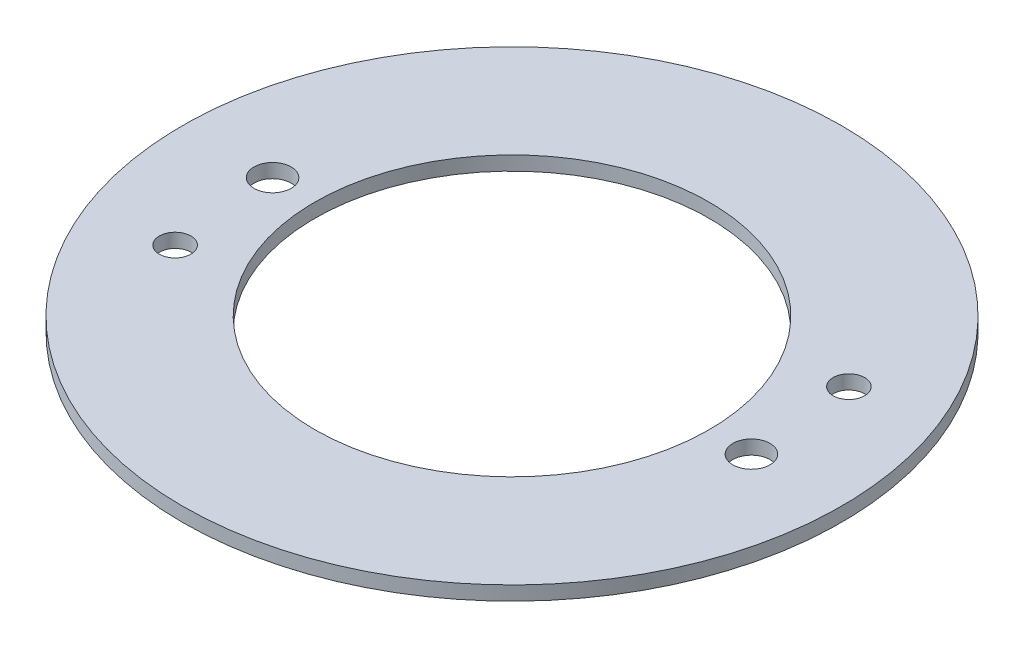
ISO-10303-21;
HEADER;
FILE_DESCRIPTION(('STEP AP214'),'2;1');
FILE_NAME('part.step','',(''),(''),'','','');
FILE_SCHEMA(('AUTOMOTIVE_DESIGN { 1 0 10303 214 1 1 1 1 }'));
ENDSEC;
DATA;
#1=APPLICATION_CONTEXT('core data for automotive mechanical design processes');
#2=APPLICATION_PROTOCOL_DEFINITION('international standard','automotive_design',2000,#1);
#3=PRODUCT_CONTEXT('',#1,'mechanical');
#4=PRODUCT('Part','Part','',(#3));
#5=PRODUCT_RELATED_PRODUCT_CATEGORY('part','',(#4));
#6=PRODUCT_DEFINITION_FORMATION('','',#4);
#7=PRODUCT_DEFINITION_CONTEXT('part definition',#1,'design');
#8=PRODUCT_DEFINITION('design','',#6,#7);
#9=PRODUCT_DEFINITION_SHAPE('','',#8);
#10=(LENGTH_UNIT() NAMED_UNIT(*) SI_UNIT(.MILLI.,.METRE.));
#11=(NAMED_UNIT(*) PLANE_ANGLE_UNIT() SI_UNIT($,.RADIAN.));
#12=(NAMED_UNIT(*) SI_UNIT($,.STERADIAN.) SOLID_ANGLE_UNIT());
#13=UNCERTAINTY_MEASURE_WITH_UNIT(LENGTH_MEASURE(1.E-05),#10,'distance_accuracy_value','');
#14=(GEOMETRIC_REPRESENTATION_CONTEXT(3) GLOBAL_UNCERTAINTY_ASSIGNED_CONTEXT((#13)) GLOBAL_UNIT_ASSIGNED_CONTEXT((#10,
#11,#12)) REPRESENTATION_CONTEXT('',''));
#15=CARTESIAN_POINT('',(0.,0.,0.));
#16=DIRECTION('',(0.,0.,1.));
#17=DIRECTION('',(1.,0.,0.));
#18=AXIS2_PLACEMENT_3D('',#15,#16,#17);
#19=CARTESIAN_POINT('',(0.,3.175,0.));
#20=DIRECTION('',(0.,-1.,0.));
#21=DIRECTION('',(0.,0.,-1.));
#22=AXIS2_PLACEMENT_3D('',#19,#20,#21);
#23=CYLINDRICAL_SURFACE('',#22,74.295);
#24=CARTESIAN_POINT('',(0.,3.175,0.));
#25=DIRECTION('',(0.,1.,0.));
#26=DIRECTION('',(0.,0.,1.));
#27=AXIS2_PLACEMENT_3D('',#24,#25,#26);
#28=CIRCLE('',#27,74.295);
#29=CARTESIAN_POINT('',(0.,3.175,74.295));
#30=VERTEX_POINT('',#29);
#31=EDGE_CURVE('E10',#30,#30,#28,.T.);
#32=ORIENTED_EDGE('',*,*,#31,.F.);
#33=EDGE_LOOP('',(#32));
#34=FACE_BOUND('',#33,.T.);
#35=CARTESIAN_POINT('',(0.,0.,0.));
#36=DIRECTION('',(0.,1.,0.));
#37=DIRECTION('',(0.,0.,1.));
#38=AXIS2_PLACEMENT_3D('',#35,#36,#37);
#39=CIRCLE('',#38,74.295);
#40=CARTESIAN_POINT('',(0.,0.,74.295));
#41=VERTEX_POINT('',#40);
#42=EDGE_CURVE('E41',#41,#41,#39,.T.);
#43=ORIENTED_EDGE('',*,*,#42,.T.);
#44=EDGE_LOOP('',(#43));
#45=FACE_BOUND('',#44,.T.);
#46=ADVANCED_FACE('F38',(#34,#45),#23,.T.);
#47=CARTESIAN_POINT('',(0.,3.175,0.));
#48=DIRECTION('',(0.,1.,0.));
#49=DIRECTION('',(0.,0.,1.));
#50=AXIS2_PLACEMENT_3D('',#47,#48,#49);
#51=PLANE('',#50);
#52=CARTESIAN_POINT('',(0.,3.175,0.));
#53=DIRECTION('',(0.,1.,0.));
#54=DIRECTION('',(0.,0.,1.));
#55=AXIS2_PLACEMENT_3D('',#52,#53,#54);
#56=CIRCLE('',#55,44.45);
#57=CARTESIAN_POINT('',(0.,3.175,44.45));
#58=VERTEX_POINT('',#57);
#59=EDGE_CURVE('E74',#58,#58,#56,.T.);
#60=ORIENTED_EDGE('',*,*,#59,.F.);
#61=EDGE_LOOP('',(#60));
#62=FACE_BOUND('',#61,.T.);
#63=CARTESIAN_POINT('',(-51.7954900291446,3.175,24.1526336584811));
#64=DIRECTION('',(0.,1.,0.));
#65=DIRECTION('',(0.,0.,1.));
#66=AXIS2_PLACEMENT_3D('',#63,#64,#65);
#67=CIRCLE('',#66,3.55600000000001);
#68=CARTESIAN_POINT('',(-51.7954900291446,3.175,27.7086336584811));
#69=VERTEX_POINT('',#68);
#70=EDGE_CURVE('E53',#69,#69,#67,.T.);
#71=ORIENTED_EDGE('',*,*,#70,.F.);
#72=EDGE_LOOP('',(#71));
#73=FACE_BOUND('',#72,.T.);
#74=CARTESIAN_POINT('',(51.7954900291446,3.175,-24.152633658481));
#75=DIRECTION('',(0.,1.,0.));
#76=DIRECTION('',(0.,0.,1.));
#77=AXIS2_PLACEMENT_3D('',#74,#75,#76);
#78=CIRCLE('',#77,3.55600000000001);
#79=CARTESIAN_POINT('',(51.7954900291446,3.175,-20.596633658481));
#80=VERTEX_POINT('',#79);
#81=EDGE_CURVE('E59',#80,#80,#78,.T.);
#82=ORIENTED_EDGE('',*,*,#81,.F.);
#83=EDGE_LOOP('',(#82));
#84=FACE_BOUND('',#83,.T.);
#85=CARTESIAN_POINT('',(53.975,3.175,0.));
#86=DIRECTION('',(0.,1.,0.));
#87=DIRECTION('',(0.,0.,1.));
#88=AXIS2_PLACEMENT_3D('',#85,#86,#87);
#89=CIRCLE('',#88,4.191);
#90=CARTESIAN_POINT('',(53.975,3.175,4.19099999999998));
#91=VERTEX_POINT('',#90);
#92=EDGE_CURVE('E60',#91,#91,#89,.T.);
#93=ORIENTED_EDGE('',*,*,#92,.F.);
#94=EDGE_LOOP('',(#93));
#95=FACE_BOUND('',#94,.T.);
#96=CARTESIAN_POINT('',(-53.975,3.175,0.));
#97=DIRECTION('',(0.,1.,0.));
#98=DIRECTION('',(0.,0.,1.));
#99=AXIS2_PLACEMENT_3D('',#96,#97,#98);
#100=CIRCLE('',#99,4.191);
#101=CARTESIAN_POINT('',(-53.975,3.175,4.19100000000001));
#102=VERTEX_POINT('',#101);
#103=EDGE_CURVE('E50',#102,#102,#100,.T.);
#104=ORIENTED_EDGE('',*,*,#103,.F.);
#105=EDGE_LOOP('',(#104));
#106=FACE_BOUND('',#105,.T.);
#107=ORIENTED_EDGE('',*,*,#31,.T.);
#108=EDGE_LOOP('',(#107));
#109=FACE_BOUND('',#108,.T.);
#110=ADVANCED_FACE('F90',(#62,#73,#84,#95,#106,#109),#51,.T.);
#111=CARTESIAN_POINT('',(0.,0.,0.));
#112=DIRECTION('',(0.,1.,0.));
#113=DIRECTION('',(0.,0.,1.));
#114=AXIS2_PLACEMENT_3D('',#111,#112,#113);
#115=PLANE('',#114);
#116=CARTESIAN_POINT('',(0.,0.,0.));
#117=DIRECTION('',(0.,1.,0.));
#118=DIRECTION('',(0.,0.,1.));
#119=AXIS2_PLACEMENT_3D('',#116,#117,#118);
#120=CIRCLE('',#119,44.45);
#121=CARTESIAN_POINT('',(0.,0.,44.45));
#122=VERTEX_POINT('',#121);
#123=EDGE_CURVE('E71',#122,#122,#120,.T.);
#124=ORIENTED_EDGE('',*,*,#123,.T.);
#125=EDGE_LOOP('',(#124));
#126=FACE_BOUND('',#125,.T.);
#127=CARTESIAN_POINT('',(-51.7954900291446,0.,24.1526336584811));
#128=DIRECTION('',(0.,1.,0.));
#129=DIRECTION('',(0.,0.,1.));
#130=AXIS2_PLACEMENT_3D('',#127,#128,#129);
#131=CIRCLE('',#130,3.55600000000001);
#132=CARTESIAN_POINT('',(-51.7954900291446,0.,27.7086336584811));
#133=VERTEX_POINT('',#132);
#134=EDGE_CURVE('E63',#133,#133,#131,.T.);
#135=ORIENTED_EDGE('',*,*,#134,.T.);
#136=EDGE_LOOP('',(#135));
#137=FACE_BOUND('',#136,.T.);
#138=CARTESIAN_POINT('',(51.7954900291446,0.,-24.152633658481));
#139=DIRECTION('',(0.,1.,0.));
#140=DIRECTION('',(0.,0.,1.));
#141=AXIS2_PLACEMENT_3D('',#138,#139,#140);
#142=CIRCLE('',#141,3.55600000000001);
#143=CARTESIAN_POINT('',(51.7954900291446,0.,-20.596633658481));
#144=VERTEX_POINT('',#143);
#145=EDGE_CURVE('E56',#144,#144,#142,.T.);
#146=ORIENTED_EDGE('',*,*,#145,.T.);
#147=EDGE_LOOP('',(#146));
#148=FACE_BOUND('',#147,.T.);
#149=CARTESIAN_POINT('',(53.975,0.,0.));
#150=DIRECTION('',(0.,1.,0.));
#151=DIRECTION('',(0.,0.,1.));
#152=AXIS2_PLACEMENT_3D('',#149,#150,#151);
#153=CIRCLE('',#152,4.191);
#154=CARTESIAN_POINT('',(53.975,0.,4.19099999999998));
#155=VERTEX_POINT('',#154);
#156=EDGE_CURVE('E68',#155,#155,#153,.T.);
#157=ORIENTED_EDGE('',*,*,#156,.T.);
#158=EDGE_LOOP('',(#157));
#159=FACE_BOUND('',#158,.T.);
#160=CARTESIAN_POINT('',(-53.975,0.,0.));
#161=DIRECTION('',(0.,1.,0.));
#162=DIRECTION('',(0.,0.,1.));
#163=AXIS2_PLACEMENT_3D('',#160,#161,#162);
#164=CIRCLE('',#163,4.191);
#165=CARTESIAN_POINT('',(-53.975,0.,4.19100000000001));
#166=VERTEX_POINT('',#165);
#167=EDGE_CURVE('E48',#166,#166,#164,.T.);
#168=ORIENTED_EDGE('',*,*,#167,.T.);
#169=EDGE_LOOP('',(#168));
#170=FACE_BOUND('',#169,.T.);
#171=ORIENTED_EDGE('',*,*,#42,.F.);
#172=EDGE_LOOP('',(#171));
#173=FACE_BOUND('',#172,.T.);
#174=ADVANCED_FACE('F80',(#126,#137,#148,#159,#170,#173),#115,.F.);
#175=CARTESIAN_POINT('',(-53.975,0.,0.));
#176=DIRECTION('',(0.,1.,0.));
#177=DIRECTION('',(0.,0.,1.));
#178=AXIS2_PLACEMENT_3D('',#175,#176,#177);
#179=CYLINDRICAL_SURFACE('',#178,4.191);
#180=ORIENTED_EDGE('',*,*,#167,.F.);
#181=EDGE_LOOP('',(#180));
#182=FACE_BOUND('',#181,.T.);
#183=ORIENTED_EDGE('',*,*,#103,.T.);
#184=EDGE_LOOP('',(#183));
#185=FACE_BOUND('',#184,.T.);
#186=ADVANCED_FACE('F102',(#182,#185),#179,.F.);
#187=CARTESIAN_POINT('',(53.975,0.,0.));
#188=DIRECTION('',(0.,1.,0.));
#189=DIRECTION('',(0.,0.,1.));
#190=AXIS2_PLACEMENT_3D('',#187,#188,#189);
#191=CYLINDRICAL_SURFACE('',#190,4.191);
#192=ORIENTED_EDGE('',*,*,#156,.F.);
#193=EDGE_LOOP('',(#192));
#194=FACE_BOUND('',#193,.T.);
#195=ORIENTED_EDGE('',*,*,#92,.T.);
#196=EDGE_LOOP('',(#195));
#197=FACE_BOUND('',#196,.T.);
#198=ADVANCED_FACE('F104',(#194,#197),#191,.F.);
#199=CARTESIAN_POINT('',(51.7954900291446,0.,-24.152633658481));
#200=DIRECTION('',(0.,1.,0.));
#201=DIRECTION('',(0.,0.,1.));
#202=AXIS2_PLACEMENT_3D('',#199,#200,#201);
#203=CYLINDRICAL_SURFACE('',#202,3.55600000000001);
#204=ORIENTED_EDGE('',*,*,#145,.F.);
#205=EDGE_LOOP('',(#204));
#206=FACE_BOUND('',#205,.T.);
#207=ORIENTED_EDGE('',*,*,#81,.T.);
#208=EDGE_LOOP('',(#207));
#209=FACE_BOUND('',#208,.T.);
#210=ADVANCED_FACE('F111',(#206,#209),#203,.F.);
#211=CARTESIAN_POINT('',(-51.7954900291446,0.,24.1526336584811));
#212=DIRECTION('',(0.,1.,0.));
#213=DIRECTION('',(0.,0.,1.));
#214=AXIS2_PLACEMENT_3D('',#211,#212,#213);
#215=CYLINDRICAL_SURFACE('',#214,3.55600000000001);
#216=ORIENTED_EDGE('',*,*,#134,.F.);
#217=EDGE_LOOP('',(#216));
#218=FACE_BOUND('',#217,.T.);
#219=ORIENTED_EDGE('',*,*,#70,.T.);
#220=EDGE_LOOP('',(#219));
#221=FACE_BOUND('',#220,.T.);
#222=ADVANCED_FACE('F86',(#218,#221),#215,.F.);
#223=CARTESIAN_POINT('',(0.,0.,0.));
#224=DIRECTION('',(0.,1.,0.));
#225=DIRECTION('',(0.,0.,1.));
#226=AXIS2_PLACEMENT_3D('',#223,#224,#225);
#227=CYLINDRICAL_SURFACE('',#226,44.45);
#228=ORIENTED_EDGE('',*,*,#123,.F.);
#229=EDGE_LOOP('',(#228));
#230=FACE_BOUND('',#229,.T.);
#231=ORIENTED_EDGE('',*,*,#59,.T.);
#232=EDGE_LOOP('',(#231));
#233=FACE_BOUND('',#232,.T.);
#234=ADVANCED_FACE('F83',(#230,#233),#227,.F.);
#235=CLOSED_SHELL('',(#46,#110,#174,#186,#198,#210,#222,#234));
#236=MANIFOLD_SOLID_BREP('B2',#235);
#237=ADVANCED_BREP_SHAPE_REPRESENTATION('',(#18,#236),#14);
#238=SHAPE_DEFINITION_REPRESENTATION(#9,#237);
ENDSEC;
END-ISO-10303-21;
